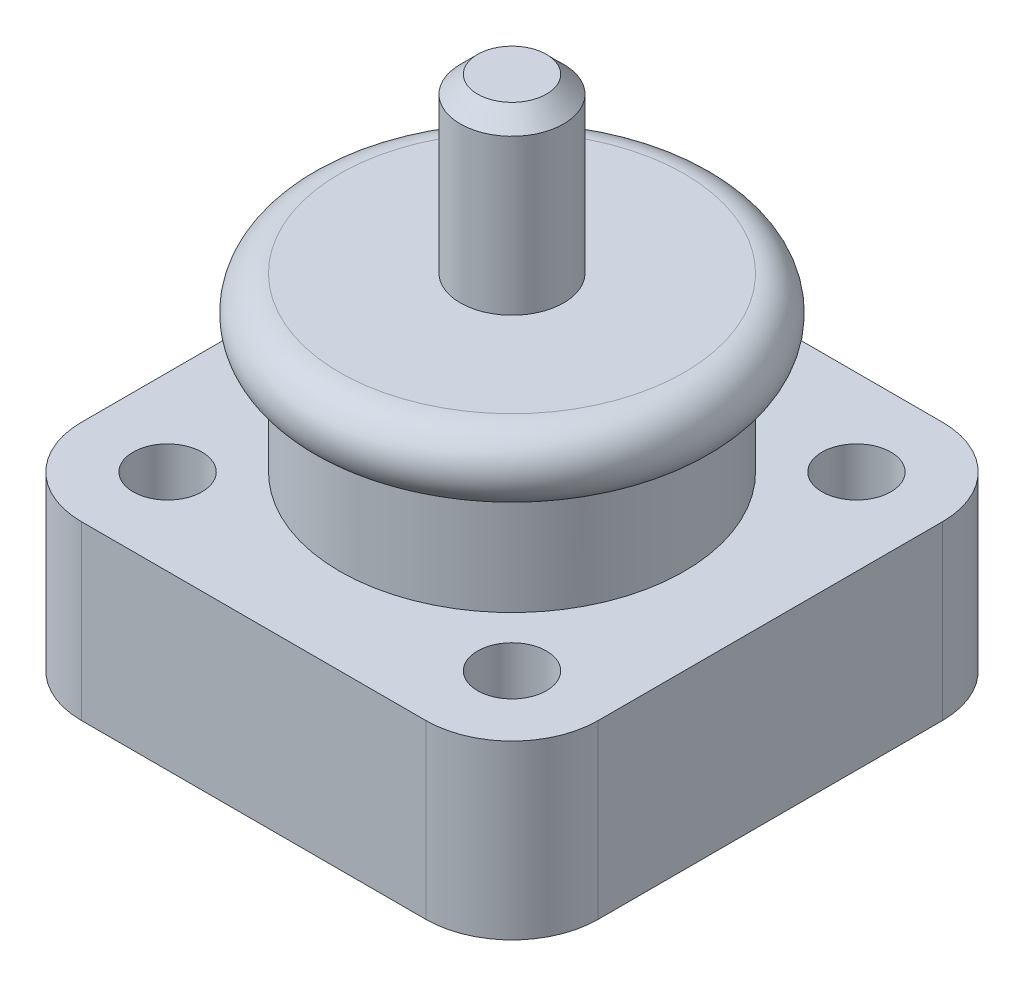
ISO-10303-21;
HEADER;
FILE_DESCRIPTION(('STEP AP214'),'2;1');
FILE_NAME('part.step','',(''),(''),'','','');
FILE_SCHEMA(('AUTOMOTIVE_DESIGN { 1 0 10303 214 1 1 1 1 }'));
ENDSEC;
DATA;
#1=APPLICATION_CONTEXT('core data for automotive mechanical design processes');
#2=APPLICATION_PROTOCOL_DEFINITION('international standard','automotive_design',2000,#1);
#3=PRODUCT_CONTEXT('',#1,'mechanical');
#4=PRODUCT('Part','Part','',(#3));
#5=PRODUCT_RELATED_PRODUCT_CATEGORY('part','',(#4));
#6=PRODUCT_DEFINITION_FORMATION('','',#4);
#7=PRODUCT_DEFINITION_CONTEXT('part definition',#1,'design');
#8=PRODUCT_DEFINITION('design','',#6,#7);
#9=PRODUCT_DEFINITION_SHAPE('','',#8);
#10=(LENGTH_UNIT() NAMED_UNIT(*) SI_UNIT(.MILLI.,.METRE.));
#11=(NAMED_UNIT(*) PLANE_ANGLE_UNIT() SI_UNIT($,.RADIAN.));
#12=(NAMED_UNIT(*) SI_UNIT($,.STERADIAN.) SOLID_ANGLE_UNIT());
#13=UNCERTAINTY_MEASURE_WITH_UNIT(LENGTH_MEASURE(1.E-05),#10,'distance_accuracy_value','');
#14=(GEOMETRIC_REPRESENTATION_CONTEXT(3) GLOBAL_UNCERTAINTY_ASSIGNED_CONTEXT((#13)) GLOBAL_UNIT_ASSIGNED_CONTEXT((#10,
#11,#12)) REPRESENTATION_CONTEXT('',''));
#15=CARTESIAN_POINT('',(0.,0.,0.));
#16=DIRECTION('',(0.,0.,1.));
#17=DIRECTION('',(1.,0.,0.));
#18=AXIS2_PLACEMENT_3D('',#15,#16,#17);
#19=CARTESIAN_POINT('',(0.,20.,0.));
#20=DIRECTION('',(0.,-1.,0.));
#21=DIRECTION('',(0.,0.,-1.));
#22=AXIS2_PLACEMENT_3D('',#19,#20,#21);
#23=CYLINDRICAL_SURFACE('',#22,10.);
#24=CARTESIAN_POINT('',(0.,10.,0.));
#25=DIRECTION('',(0.,1.,0.));
#26=DIRECTION('',(0.,0.,1.));
#27=AXIS2_PLACEMENT_3D('',#24,#25,#26);
#28=CIRCLE('',#27,10.);
#29=CARTESIAN_POINT('',(0.,10.,10.));
#30=VERTEX_POINT('',#29);
#31=EDGE_CURVE('E177',#30,#30,#28,.T.);
#32=ORIENTED_EDGE('',*,*,#31,.T.);
#33=EDGE_LOOP('',(#32));
#34=FACE_BOUND('',#33,.T.);
#35=CARTESIAN_POINT('',(0.,16.,0.));
#36=DIRECTION('',(0.,1.,0.));
#37=DIRECTION('',(0.,0.,1.));
#38=AXIS2_PLACEMENT_3D('',#35,#36,#37);
#39=CIRCLE('',#38,10.);
#40=CARTESIAN_POINT('',(0.,16.,10.));
#41=VERTEX_POINT('',#40);
#42=EDGE_CURVE('E165',#41,#41,#39,.T.);
#43=ORIENTED_EDGE('',*,*,#42,.F.);
#44=EDGE_LOOP('',(#43));
#45=FACE_BOUND('',#44,.T.);
#46=ADVANCED_FACE('F37',(#34,#45),#23,.T.);
#47=CARTESIAN_POINT('',(10.,10.,10.));
#48=DIRECTION('',(0.,1.,0.));
#49=DIRECTION('',(0.,0.,1.));
#50=AXIS2_PLACEMENT_3D('',#47,#48,#49);
#51=PLANE('',#50);
#52=ORIENTED_EDGE('',*,*,#31,.F.);
#53=EDGE_LOOP('',(#52));
#54=FACE_BOUND('',#53,.T.);
#55=CARTESIAN_POINT('',(-9.99999999999999,10.,10.));
#56=DIRECTION('',(0.,1.,0.));
#57=DIRECTION('',(0.,0.,1.));
#58=AXIS2_PLACEMENT_3D('',#55,#56,#57);
#59=CIRCLE('',#58,2.);
#60=CARTESIAN_POINT('',(-9.99999999999999,10.,12.));
#61=VERTEX_POINT('',#60);
#62=EDGE_CURVE('E187',#61,#61,#59,.T.);
#63=ORIENTED_EDGE('',*,*,#62,.F.);
#64=EDGE_LOOP('',(#63));
#65=FACE_BOUND('',#64,.T.);
#66=CARTESIAN_POINT('',(10.,10.,-10.));
#67=DIRECTION('',(0.,1.,0.));
#68=DIRECTION('',(0.,0.,1.));
#69=AXIS2_PLACEMENT_3D('',#66,#67,#68);
#70=CIRCLE('',#69,2.);
#71=CARTESIAN_POINT('',(10.,10.,-8.));
#72=VERTEX_POINT('',#71);
#73=EDGE_CURVE('E140',#72,#72,#70,.T.);
#74=ORIENTED_EDGE('',*,*,#73,.F.);
#75=EDGE_LOOP('',(#74));
#76=FACE_BOUND('',#75,.T.);
#77=CARTESIAN_POINT('',(10.,10.,10.));
#78=DIRECTION('',(0.,1.,0.));
#79=DIRECTION('',(0.,0.,1.));
#80=AXIS2_PLACEMENT_3D('',#77,#78,#79);
#81=CIRCLE('',#80,5.);
#82=CARTESIAN_POINT('',(9.99999999999997,10.,15.));
#83=VERTEX_POINT('',#82);
#84=CARTESIAN_POINT('',(15.,10.,9.99999999999997));
#85=VERTEX_POINT('',#84);
#86=EDGE_CURVE('E151',#83,#85,#81,.T.);
#87=ORIENTED_EDGE('',*,*,#86,.T.);
#88=DIRECTION('',(0.,0.,-1.));
#89=VECTOR('',#88,1.);
#90=CARTESIAN_POINT('',(15.,10.,9.99999999999997));
#91=LINE('',#90,#89);
#92=CARTESIAN_POINT('',(15.,10.,-9.99999999999996));
#93=VERTEX_POINT('',#92);
#94=EDGE_CURVE('E98',#85,#93,#91,.T.);
#95=ORIENTED_EDGE('',*,*,#94,.T.);
#96=CARTESIAN_POINT('',(10.,10.,-10.));
#97=DIRECTION('',(0.,1.,0.));
#98=DIRECTION('',(0.,0.,1.));
#99=AXIS2_PLACEMENT_3D('',#96,#97,#98);
#100=CIRCLE('',#99,5.);
#101=CARTESIAN_POINT('',(9.99999999999997,10.,-15.));
#102=VERTEX_POINT('',#101);
#103=EDGE_CURVE('E205',#93,#102,#100,.T.);
#104=ORIENTED_EDGE('',*,*,#103,.T.);
#105=DIRECTION('',(-1.,0.,0.));
#106=VECTOR('',#105,1.);
#107=CARTESIAN_POINT('',(-9.99999999999996,10.,-15.));
#108=LINE('',#107,#106);
#109=CARTESIAN_POINT('',(-9.99999999999999,10.,-15.));
#110=VERTEX_POINT('',#109);
#111=EDGE_CURVE('E207',#102,#110,#108,.T.);
#112=ORIENTED_EDGE('',*,*,#111,.T.);
#113=CARTESIAN_POINT('',(-9.99999999999999,10.,-10.));
#114=DIRECTION('',(0.,1.,0.));
#115=DIRECTION('',(0.,0.,-1.));
#116=AXIS2_PLACEMENT_3D('',#113,#114,#115);
#117=CIRCLE('',#116,5.);
#118=CARTESIAN_POINT('',(-15.,10.,-9.99999999999996));
#119=VERTEX_POINT('',#118);
#120=EDGE_CURVE('E118',#110,#119,#117,.T.);
#121=ORIENTED_EDGE('',*,*,#120,.T.);
#122=DIRECTION('',(0.,0.,1.));
#123=VECTOR('',#122,1.);
#124=CARTESIAN_POINT('',(-15.,10.,9.99999999999997));
#125=LINE('',#124,#123);
#126=CARTESIAN_POINT('',(-15.,10.,9.99999999999997));
#127=VERTEX_POINT('',#126);
#128=EDGE_CURVE('E111',#119,#127,#125,.T.);
#129=ORIENTED_EDGE('',*,*,#128,.T.);
#130=CARTESIAN_POINT('',(-9.99999999999999,10.,10.));
#131=DIRECTION('',(0.,1.,0.));
#132=DIRECTION('',(0.,0.,-1.));
#133=AXIS2_PLACEMENT_3D('',#130,#131,#132);
#134=CIRCLE('',#133,5.);
#135=CARTESIAN_POINT('',(-9.99999999999996,10.,15.));
#136=VERTEX_POINT('',#135);
#137=EDGE_CURVE('E116',#127,#136,#134,.T.);
#138=ORIENTED_EDGE('',*,*,#137,.T.);
#139=DIRECTION('',(1.,0.,0.));
#140=VECTOR('',#139,1.);
#141=CARTESIAN_POINT('',(-9.99999999999996,10.,15.));
#142=LINE('',#141,#140);
#143=EDGE_CURVE('E54',#136,#83,#142,.T.);
#144=ORIENTED_EDGE('',*,*,#143,.T.);
#145=EDGE_LOOP('',(#87,#95,#104,#112,#121,#129,#138,#144));
#146=FACE_BOUND('',#145,.T.);
#147=CARTESIAN_POINT('',(-9.99999999999999,10.,-10.));
#148=DIRECTION('',(0.,1.,0.));
#149=DIRECTION('',(0.,0.,1.));
#150=AXIS2_PLACEMENT_3D('',#147,#148,#149);
#151=CIRCLE('',#150,2.);
#152=CARTESIAN_POINT('',(-9.99999999999999,10.,-8.));
#153=VERTEX_POINT('',#152);
#154=EDGE_CURVE('E193',#153,#153,#151,.T.);
#155=ORIENTED_EDGE('',*,*,#154,.F.);
#156=EDGE_LOOP('',(#155));
#157=FACE_BOUND('',#156,.T.);
#158=CARTESIAN_POINT('',(10.,10.,10.));
#159=DIRECTION('',(0.,1.,0.));
#160=DIRECTION('',(0.,0.,1.));
#161=AXIS2_PLACEMENT_3D('',#158,#159,#160);
#162=CIRCLE('',#161,2.);
#163=CARTESIAN_POINT('',(10.,10.,12.));
#164=VERTEX_POINT('',#163);
#165=EDGE_CURVE('E181',#164,#164,#162,.T.);
#166=ORIENTED_EDGE('',*,*,#165,.F.);
#167=EDGE_LOOP('',(#166));
#168=FACE_BOUND('',#167,.T.);
#169=ADVANCED_FACE('F113',(#54,#65,#76,#146,#157,#168),#51,.T.);
#170=CARTESIAN_POINT('',(10.,0.,10.));
#171=DIRECTION('',(0.,1.,0.));
#172=DIRECTION('',(0.,0.,1.));
#173=AXIS2_PLACEMENT_3D('',#170,#171,#172);
#174=PLANE('',#173);
#175=CARTESIAN_POINT('',(0.,0.,0.));
#176=DIRECTION('',(0.,-1.,0.));
#177=DIRECTION('',(0.,0.,-1.));
#178=AXIS2_PLACEMENT_3D('',#175,#176,#177);
#179=CIRCLE('',#178,8.);
#180=CARTESIAN_POINT('',(0.,0.,-8.));
#181=VERTEX_POINT('',#180);
#182=EDGE_CURVE('E272',#181,#181,#179,.T.);
#183=ORIENTED_EDGE('',*,*,#182,.F.);
#184=EDGE_LOOP('',(#183));
#185=FACE_BOUND('',#184,.T.);
#186=CARTESIAN_POINT('',(10.,0.,10.));
#187=DIRECTION('',(0.,1.,0.));
#188=DIRECTION('',(0.,0.,1.));
#189=AXIS2_PLACEMENT_3D('',#186,#187,#188);
#190=CIRCLE('',#189,5.);
#191=CARTESIAN_POINT('',(9.99999999999997,0.,15.));
#192=VERTEX_POINT('',#191);
#193=CARTESIAN_POINT('',(15.,0.,9.99999999999997));
#194=VERTEX_POINT('',#193);
#195=EDGE_CURVE('E136',#192,#194,#190,.T.);
#196=ORIENTED_EDGE('',*,*,#195,.F.);
#197=DIRECTION('',(1.,0.,0.));
#198=VECTOR('',#197,1.);
#199=CARTESIAN_POINT('',(-9.99999999999996,0.,15.));
#200=LINE('',#199,#198);
#201=CARTESIAN_POINT('',(-9.99999999999996,0.,15.));
#202=VERTEX_POINT('',#201);
#203=EDGE_CURVE('E89',#202,#192,#200,.T.);
#204=ORIENTED_EDGE('',*,*,#203,.F.);
#205=CARTESIAN_POINT('',(-9.99999999999999,0.,10.));
#206=DIRECTION('',(0.,1.,0.));
#207=DIRECTION('',(0.,0.,-1.));
#208=AXIS2_PLACEMENT_3D('',#205,#206,#207);
#209=CIRCLE('',#208,5.);
#210=CARTESIAN_POINT('',(-15.,0.,9.99999999999997));
#211=VERTEX_POINT('',#210);
#212=EDGE_CURVE('E83',#211,#202,#209,.T.);
#213=ORIENTED_EDGE('',*,*,#212,.F.);
#214=DIRECTION('',(0.,0.,1.));
#215=VECTOR('',#214,1.);
#216=CARTESIAN_POINT('',(-15.,0.,9.99999999999997));
#217=LINE('',#216,#215);
#218=CARTESIAN_POINT('',(-15.,0.,-9.99999999999996));
#219=VERTEX_POINT('',#218);
#220=EDGE_CURVE('E126',#219,#211,#217,.T.);
#221=ORIENTED_EDGE('',*,*,#220,.F.);
#222=CARTESIAN_POINT('',(-9.99999999999999,0.,-10.));
#223=DIRECTION('',(0.,1.,0.));
#224=DIRECTION('',(0.,0.,-1.));
#225=AXIS2_PLACEMENT_3D('',#222,#223,#224);
#226=CIRCLE('',#225,5.);
#227=CARTESIAN_POINT('',(-9.99999999999999,0.,-15.));
#228=VERTEX_POINT('',#227);
#229=EDGE_CURVE('E146',#228,#219,#226,.T.);
#230=ORIENTED_EDGE('',*,*,#229,.F.);
#231=DIRECTION('',(-1.,0.,0.));
#232=VECTOR('',#231,1.);
#233=CARTESIAN_POINT('',(-9.99999999999996,0.,-15.));
#234=LINE('',#233,#232);
#235=CARTESIAN_POINT('',(9.99999999999997,0.,-15.));
#236=VERTEX_POINT('',#235);
#237=EDGE_CURVE('E144',#236,#228,#234,.T.);
#238=ORIENTED_EDGE('',*,*,#237,.F.);
#239=CARTESIAN_POINT('',(10.,0.,-10.));
#240=DIRECTION('',(0.,1.,0.));
#241=DIRECTION('',(0.,0.,1.));
#242=AXIS2_PLACEMENT_3D('',#239,#240,#241);
#243=CIRCLE('',#242,5.);
#244=CARTESIAN_POINT('',(15.,0.,-9.99999999999996));
#245=VERTEX_POINT('',#244);
#246=EDGE_CURVE('E142',#245,#236,#243,.T.);
#247=ORIENTED_EDGE('',*,*,#246,.F.);
#248=DIRECTION('',(0.,0.,-1.));
#249=VECTOR('',#248,1.);
#250=CARTESIAN_POINT('',(15.,0.,9.99999999999997));
#251=LINE('',#250,#249);
#252=EDGE_CURVE('E139',#194,#245,#251,.T.);
#253=ORIENTED_EDGE('',*,*,#252,.F.);
#254=EDGE_LOOP('',(#196,#204,#213,#221,#230,#238,#247,#253));
#255=FACE_BOUND('',#254,.T.);
#256=CARTESIAN_POINT('',(10.,0.,-10.));
#257=DIRECTION('',(0.,1.,0.));
#258=DIRECTION('',(0.,0.,1.));
#259=AXIS2_PLACEMENT_3D('',#256,#257,#258);
#260=CIRCLE('',#259,2.);
#261=CARTESIAN_POINT('',(10.,0.,-8.));
#262=VERTEX_POINT('',#261);
#263=EDGE_CURVE('E196',#262,#262,#260,.T.);
#264=ORIENTED_EDGE('',*,*,#263,.T.);
#265=EDGE_LOOP('',(#264));
#266=FACE_BOUND('',#265,.T.);
#267=CARTESIAN_POINT('',(-9.99999999999999,0.,-10.));
#268=DIRECTION('',(0.,1.,0.));
#269=DIRECTION('',(0.,0.,1.));
#270=AXIS2_PLACEMENT_3D('',#267,#268,#269);
#271=CIRCLE('',#270,2.);
#272=CARTESIAN_POINT('',(-9.99999999999999,0.,-8.));
#273=VERTEX_POINT('',#272);
#274=EDGE_CURVE('E190',#273,#273,#271,.T.);
#275=ORIENTED_EDGE('',*,*,#274,.T.);
#276=EDGE_LOOP('',(#275));
#277=FACE_BOUND('',#276,.T.);
#278=CARTESIAN_POINT('',(-9.99999999999999,0.,10.));
#279=DIRECTION('',(0.,1.,0.));
#280=DIRECTION('',(0.,0.,1.));
#281=AXIS2_PLACEMENT_3D('',#278,#279,#280);
#282=CIRCLE('',#281,2.);
#283=CARTESIAN_POINT('',(-9.99999999999999,0.,12.));
#284=VERTEX_POINT('',#283);
#285=EDGE_CURVE('E184',#284,#284,#282,.T.);
#286=ORIENTED_EDGE('',*,*,#285,.T.);
#287=EDGE_LOOP('',(#286));
#288=FACE_BOUND('',#287,.T.);
#289=CARTESIAN_POINT('',(10.,0.,10.));
#290=DIRECTION('',(0.,1.,0.));
#291=DIRECTION('',(0.,0.,1.));
#292=AXIS2_PLACEMENT_3D('',#289,#290,#291);
#293=CIRCLE('',#292,2.);
#294=CARTESIAN_POINT('',(10.,0.,12.));
#295=VERTEX_POINT('',#294);
#296=EDGE_CURVE('E180',#295,#295,#293,.T.);
#297=ORIENTED_EDGE('',*,*,#296,.T.);
#298=EDGE_LOOP('',(#297));
#299=FACE_BOUND('',#298,.T.);
#300=ADVANCED_FACE('F220',(#185,#255,#266,#277,#288,#299),#174,.F.);
#301=CARTESIAN_POINT('',(10.,10.,10.));
#302=DIRECTION('',(0.,-1.,0.));
#303=DIRECTION('',(0.,0.,-1.));
#304=AXIS2_PLACEMENT_3D('',#301,#302,#303);
#305=CYLINDRICAL_SURFACE('',#304,5.);
#306=ORIENTED_EDGE('',*,*,#195,.T.);
#307=DIRECTION('',(0.,-1.,0.));
#308=VECTOR('',#307,1.);
#309=CARTESIAN_POINT('',(15.,10.,9.99999999999997));
#310=LINE('',#309,#308);
#311=EDGE_CURVE('E164',#85,#194,#310,.T.);
#312=ORIENTED_EDGE('',*,*,#311,.F.);
#313=ORIENTED_EDGE('',*,*,#86,.F.);
#314=DIRECTION('',(0.,-1.,0.));
#315=VECTOR('',#314,1.);
#316=CARTESIAN_POINT('',(9.99999999999997,10.,15.));
#317=LINE('',#316,#315);
#318=EDGE_CURVE('E132',#83,#192,#317,.T.);
#319=ORIENTED_EDGE('',*,*,#318,.T.);
#320=EDGE_LOOP('',(#306,#312,#313,#319));
#321=FACE_BOUND('',#320,.T.);
#322=ADVANCED_FACE('F225',(#321),#305,.T.);
#323=CARTESIAN_POINT('',(15.,10.,9.99999999999997));
#324=DIRECTION('',(-1.,0.,0.));
#325=DIRECTION('',(0.,0.,1.));
#326=AXIS2_PLACEMENT_3D('',#323,#324,#325);
#327=PLANE('',#326);
#328=ORIENTED_EDGE('',*,*,#252,.T.);
#329=DIRECTION('',(0.,-1.,0.));
#330=VECTOR('',#329,1.);
#331=CARTESIAN_POINT('',(15.,10.,-9.99999999999996));
#332=LINE('',#331,#330);
#333=EDGE_CURVE('E161',#93,#245,#332,.T.);
#334=ORIENTED_EDGE('',*,*,#333,.F.);
#335=ORIENTED_EDGE('',*,*,#94,.F.);
#336=ORIENTED_EDGE('',*,*,#311,.T.);
#337=EDGE_LOOP('',(#328,#334,#335,#336));
#338=FACE_BOUND('',#337,.T.);
#339=ADVANCED_FACE('F269',(#338),#327,.F.);
#340=CARTESIAN_POINT('',(10.,10.,-10.));
#341=DIRECTION('',(0.,-1.,0.));
#342=DIRECTION('',(0.,0.,-1.));
#343=AXIS2_PLACEMENT_3D('',#340,#341,#342);
#344=CYLINDRICAL_SURFACE('',#343,5.);
#345=ORIENTED_EDGE('',*,*,#246,.T.);
#346=DIRECTION('',(0.,-1.,0.));
#347=VECTOR('',#346,1.);
#348=CARTESIAN_POINT('',(9.99999999999997,10.,-15.));
#349=LINE('',#348,#347);
#350=EDGE_CURVE('E158',#102,#236,#349,.T.);
#351=ORIENTED_EDGE('',*,*,#350,.F.);
#352=ORIENTED_EDGE('',*,*,#103,.F.);
#353=ORIENTED_EDGE('',*,*,#333,.T.);
#354=EDGE_LOOP('',(#345,#351,#352,#353));
#355=FACE_BOUND('',#354,.T.);
#356=ADVANCED_FACE('F417',(#355),#344,.T.);
#357=CARTESIAN_POINT('',(-9.99999999999996,10.,-15.));
#358=DIRECTION('',(0.,0.,1.));
#359=DIRECTION('',(1.,0.,0.));
#360=AXIS2_PLACEMENT_3D('',#357,#358,#359);
#361=PLANE('',#360);
#362=ORIENTED_EDGE('',*,*,#237,.T.);
#363=DIRECTION('',(0.,-1.,0.));
#364=VECTOR('',#363,1.);
#365=CARTESIAN_POINT('',(-9.99999999999999,10.,-15.));
#366=LINE('',#365,#364);
#367=EDGE_CURVE('E155',#110,#228,#366,.T.);
#368=ORIENTED_EDGE('',*,*,#367,.F.);
#369=ORIENTED_EDGE('',*,*,#111,.F.);
#370=ORIENTED_EDGE('',*,*,#350,.T.);
#371=EDGE_LOOP('',(#362,#368,#369,#370));
#372=FACE_BOUND('',#371,.T.);
#373=ADVANCED_FACE('F213',(#372),#361,.F.);
#374=CARTESIAN_POINT('',(-9.99999999999999,10.,-10.));
#375=DIRECTION('',(0.,-1.,0.));
#376=DIRECTION('',(0.,0.,-1.));
#377=AXIS2_PLACEMENT_3D('',#374,#375,#376);
#378=CYLINDRICAL_SURFACE('',#377,5.);
#379=ORIENTED_EDGE('',*,*,#229,.T.);
#380=DIRECTION('',(0.,-1.,0.));
#381=VECTOR('',#380,1.);
#382=CARTESIAN_POINT('',(-15.,10.,-9.99999999999996));
#383=LINE('',#382,#381);
#384=EDGE_CURVE('E127',#119,#219,#383,.T.);
#385=ORIENTED_EDGE('',*,*,#384,.F.);
#386=ORIENTED_EDGE('',*,*,#120,.F.);
#387=ORIENTED_EDGE('',*,*,#367,.T.);
#388=EDGE_LOOP('',(#379,#385,#386,#387));
#389=FACE_BOUND('',#388,.T.);
#390=ADVANCED_FACE('F217',(#389),#378,.T.);
#391=CARTESIAN_POINT('',(-15.,10.,9.99999999999997));
#392=DIRECTION('',(1.,0.,0.));
#393=DIRECTION('',(0.,0.,-1.));
#394=AXIS2_PLACEMENT_3D('',#391,#392,#393);
#395=PLANE('',#394);
#396=ORIENTED_EDGE('',*,*,#220,.T.);
#397=DIRECTION('',(0.,-1.,0.));
#398=VECTOR('',#397,1.);
#399=CARTESIAN_POINT('',(-15.,10.,9.99999999999997));
#400=LINE('',#399,#398);
#401=EDGE_CURVE('E123',#127,#211,#400,.T.);
#402=ORIENTED_EDGE('',*,*,#401,.F.);
#403=ORIENTED_EDGE('',*,*,#128,.F.);
#404=ORIENTED_EDGE('',*,*,#384,.T.);
#405=EDGE_LOOP('',(#396,#402,#403,#404));
#406=FACE_BOUND('',#405,.T.);
#407=ADVANCED_FACE('F124',(#406),#395,.F.);
#408=CARTESIAN_POINT('',(-9.99999999999999,10.,10.));
#409=DIRECTION('',(0.,-1.,0.));
#410=DIRECTION('',(0.,0.,-1.));
#411=AXIS2_PLACEMENT_3D('',#408,#409,#410);
#412=CYLINDRICAL_SURFACE('',#411,5.);
#413=ORIENTED_EDGE('',*,*,#212,.T.);
#414=DIRECTION('',(0.,-1.,0.));
#415=VECTOR('',#414,1.);
#416=CARTESIAN_POINT('',(-9.99999999999996,10.,15.));
#417=LINE('',#416,#415);
#418=EDGE_CURVE('E128',#136,#202,#417,.T.);
#419=ORIENTED_EDGE('',*,*,#418,.F.);
#420=ORIENTED_EDGE('',*,*,#137,.F.);
#421=ORIENTED_EDGE('',*,*,#401,.T.);
#422=EDGE_LOOP('',(#413,#419,#420,#421));
#423=FACE_BOUND('',#422,.T.);
#424=ADVANCED_FACE('F130',(#423),#412,.T.);
#425=CARTESIAN_POINT('',(-9.99999999999996,10.,15.));
#426=DIRECTION('',(0.,0.,-1.));
#427=DIRECTION('',(-1.,0.,0.));
#428=AXIS2_PLACEMENT_3D('',#425,#426,#427);
#429=PLANE('',#428);
#430=ORIENTED_EDGE('',*,*,#203,.T.);
#431=ORIENTED_EDGE('',*,*,#318,.F.);
#432=ORIENTED_EDGE('',*,*,#143,.F.);
#433=ORIENTED_EDGE('',*,*,#418,.T.);
#434=EDGE_LOOP('',(#430,#431,#432,#433));
#435=FACE_BOUND('',#434,.T.);
#436=ADVANCED_FACE('F227',(#435),#429,.F.);
#437=CARTESIAN_POINT('',(10.,10.,-10.));
#438=DIRECTION('',(0.,-1.,0.));
#439=DIRECTION('',(0.,0.,-1.));
#440=AXIS2_PLACEMENT_3D('',#437,#438,#439);
#441=CYLINDRICAL_SURFACE('',#440,2.);
#442=ORIENTED_EDGE('',*,*,#73,.T.);
#443=EDGE_LOOP('',(#442));
#444=FACE_BOUND('',#443,.T.);
#445=ORIENTED_EDGE('',*,*,#263,.F.);
#446=EDGE_LOOP('',(#445));
#447=FACE_BOUND('',#446,.T.);
#448=ADVANCED_FACE('F229',(#444,#447),#441,.F.);
#449=CARTESIAN_POINT('',(-9.99999999999999,10.,-10.));
#450=DIRECTION('',(0.,-1.,0.));
#451=DIRECTION('',(0.,0.,-1.));
#452=AXIS2_PLACEMENT_3D('',#449,#450,#451);
#453=CYLINDRICAL_SURFACE('',#452,2.);
#454=ORIENTED_EDGE('',*,*,#154,.T.);
#455=EDGE_LOOP('',(#454));
#456=FACE_BOUND('',#455,.T.);
#457=ORIENTED_EDGE('',*,*,#274,.F.);
#458=EDGE_LOOP('',(#457));
#459=FACE_BOUND('',#458,.T.);
#460=ADVANCED_FACE('F235',(#456,#459),#453,.F.);
#461=CARTESIAN_POINT('',(-9.99999999999999,10.,10.));
#462=DIRECTION('',(0.,-1.,0.));
#463=DIRECTION('',(0.,0.,-1.));
#464=AXIS2_PLACEMENT_3D('',#461,#462,#463);
#465=CYLINDRICAL_SURFACE('',#464,2.);
#466=ORIENTED_EDGE('',*,*,#62,.T.);
#467=EDGE_LOOP('',(#466));
#468=FACE_BOUND('',#467,.T.);
#469=ORIENTED_EDGE('',*,*,#285,.F.);
#470=EDGE_LOOP('',(#469));
#471=FACE_BOUND('',#470,.T.);
#472=ADVANCED_FACE('F257',(#468,#471),#465,.F.);
#473=CARTESIAN_POINT('',(10.,10.,10.));
#474=DIRECTION('',(0.,-1.,0.));
#475=DIRECTION('',(0.,0.,-1.));
#476=AXIS2_PLACEMENT_3D('',#473,#474,#475);
#477=CYLINDRICAL_SURFACE('',#476,2.);
#478=ORIENTED_EDGE('',*,*,#165,.T.);
#479=EDGE_LOOP('',(#478));
#480=FACE_BOUND('',#479,.T.);
#481=ORIENTED_EDGE('',*,*,#296,.F.);
#482=EDGE_LOOP('',(#481));
#483=FACE_BOUND('',#482,.T.);
#484=ADVANCED_FACE('F253',(#480,#483),#477,.F.);
#485=CARTESIAN_POINT('',(0.,18.,0.));
#486=DIRECTION('',(0.,-1.,0.));
#487=DIRECTION('',(0.,0.,-1.));
#488=AXIS2_PLACEMENT_3D('',#485,#486,#487);
#489=TOROIDAL_SURFACE('',#488,10.,2.);
#490=CARTESIAN_POINT('',(0.,20.,0.));
#491=DIRECTION('',(0.,-1.,0.));
#492=DIRECTION('',(0.,0.,-1.));
#493=AXIS2_PLACEMENT_3D('',#490,#491,#492);
#494=CIRCLE('',#493,10.);
#495=CARTESIAN_POINT('',(0.,20.,-10.));
#496=VERTEX_POINT('',#495);
#497=EDGE_CURVE('E175',#496,#496,#494,.F.);
#498=ORIENTED_EDGE('',*,*,#497,.F.);
#499=EDGE_LOOP('',(#498));
#500=FACE_BOUND('',#499,.T.);
#501=ORIENTED_EDGE('',*,*,#42,.T.);
#502=EDGE_LOOP('',(#501));
#503=FACE_BOUND('',#502,.T.);
#504=ADVANCED_FACE('F256',(#500,#503),#489,.T.);
#505=CARTESIAN_POINT('',(0.,20.,0.));
#506=DIRECTION('',(0.,1.,0.));
#507=DIRECTION('',(0.,0.,1.));
#508=AXIS2_PLACEMENT_3D('',#505,#506,#507);
#509=PLANE('',#508);
#510=CARTESIAN_POINT('',(0.,20.,0.));
#511=DIRECTION('',(0.,1.,0.));
#512=DIRECTION('',(0.,0.,1.));
#513=AXIS2_PLACEMENT_3D('',#510,#511,#512);
#514=CIRCLE('',#513,3.);
#515=CARTESIAN_POINT('',(0.,20.,3.));
#516=VERTEX_POINT('',#515);
#517=EDGE_CURVE('E277',#516,#516,#514,.T.);
#518=ORIENTED_EDGE('',*,*,#517,.F.);
#519=EDGE_LOOP('',(#518));
#520=FACE_BOUND('',#519,.T.);
#521=ORIENTED_EDGE('',*,*,#497,.T.);
#522=EDGE_LOOP('',(#521));
#523=FACE_BOUND('',#522,.T.);
#524=ADVANCED_FACE('F251',(#520,#523),#509,.T.);
#525=CARTESIAN_POINT('',(0.,30.,0.));
#526=DIRECTION('',(0.,-1.,0.));
#527=DIRECTION('',(0.,0.,-1.));
#528=AXIS2_PLACEMENT_3D('',#525,#526,#527);
#529=CYLINDRICAL_SURFACE('',#528,3.);
#530=CARTESIAN_POINT('',(0.,29.,0.));
#531=DIRECTION('',(0.,1.,0.));
#532=DIRECTION('',(0.,0.,1.));
#533=AXIS2_PLACEMENT_3D('',#530,#531,#532);
#534=CIRCLE('',#533,3.);
#535=CARTESIAN_POINT('',(0.,29.,3.));
#536=VERTEX_POINT('',#535);
#537=EDGE_CURVE('E11',#536,#536,#534,.F.);
#538=ORIENTED_EDGE('',*,*,#537,.T.);
#539=EDGE_LOOP('',(#538));
#540=FACE_BOUND('',#539,.T.);
#541=ORIENTED_EDGE('',*,*,#517,.T.);
#542=EDGE_LOOP('',(#541));
#543=FACE_BOUND('',#542,.T.);
#544=ADVANCED_FACE('F290',(#540,#543),#529,.T.);
#545=CARTESIAN_POINT('',(0.,30.,0.));
#546=DIRECTION('',(0.,1.,0.));
#547=DIRECTION('',(0.,0.,1.));
#548=AXIS2_PLACEMENT_3D('',#545,#546,#547);
#549=PLANE('',#548);
#550=CARTESIAN_POINT('',(0.,30.,0.));
#551=DIRECTION('',(0.,1.,0.));
#552=DIRECTION('',(0.,0.,1.));
#553=AXIS2_PLACEMENT_3D('',#550,#551,#552);
#554=CIRCLE('',#553,1.99999999999999);
#555=CARTESIAN_POINT('',(0.,30.,1.99999999999999));
#556=VERTEX_POINT('',#555);
#557=EDGE_CURVE('E46',#556,#556,#554,.T.);
#558=ORIENTED_EDGE('',*,*,#557,.T.);
#559=EDGE_LOOP('',(#558));
#560=FACE_BOUND('',#559,.T.);
#561=ADVANCED_FACE('F295',(#560),#549,.T.);
#562=CARTESIAN_POINT('',(0.,30.,0.));
#563=DIRECTION('',(0.,-1.,0.));
#564=DIRECTION('',(0.,0.,-1.));
#565=AXIS2_PLACEMENT_3D('',#562,#563,#564);
#566=CONICAL_SURFACE('',#565,1.99999999999999,0.785398163397446);
#567=ORIENTED_EDGE('',*,*,#537,.F.);
#568=EDGE_LOOP('',(#567));
#569=FACE_BOUND('',#568,.T.);
#570=ORIENTED_EDGE('',*,*,#557,.F.);
#571=EDGE_LOOP('',(#570));
#572=FACE_BOUND('',#571,.T.);
#573=ADVANCED_FACE('F39',(#569,#572),#566,.T.);
#574=CARTESIAN_POINT('',(0.,2.,0.));
#575=DIRECTION('',(0.,-1.,0.));
#576=DIRECTION('',(0.,0.,-1.));
#577=AXIS2_PLACEMENT_3D('',#574,#575,#576);
#578=CYLINDRICAL_SURFACE('',#577,8.);
#579=CARTESIAN_POINT('',(0.,2.,0.));
#580=DIRECTION('',(0.,-1.,0.));
#581=DIRECTION('',(0.,0.,-1.));
#582=AXIS2_PLACEMENT_3D('',#579,#580,#581);
#583=CIRCLE('',#582,8.);
#584=CARTESIAN_POINT('',(0.,2.,-8.));
#585=VERTEX_POINT('',#584);
#586=EDGE_CURVE('E274',#585,#585,#583,.T.);
#587=ORIENTED_EDGE('',*,*,#586,.F.);
#588=EDGE_LOOP('',(#587));
#589=FACE_BOUND('',#588,.T.);
#590=ORIENTED_EDGE('',*,*,#182,.T.);
#591=EDGE_LOOP('',(#590));
#592=FACE_BOUND('',#591,.T.);
#593=ADVANCED_FACE('F299',(#589,#592),#578,.F.);
#594=CARTESIAN_POINT('',(0.,2.,0.));
#595=DIRECTION('',(0.,-1.,0.));
#596=DIRECTION('',(0.,0.,-1.));
#597=AXIS2_PLACEMENT_3D('',#594,#595,#596);
#598=PLANE('',#597);
#599=ORIENTED_EDGE('',*,*,#586,.T.);
#600=EDGE_LOOP('',(#599));
#601=FACE_BOUND('',#600,.T.);
#602=ADVANCED_FACE('F302',(#601),#598,.T.);
#603=CLOSED_SHELL('',(#46,#169,#300,#322,#339,#356,#373,#390,#407,#424,#436,#448,#460,#472,#484,
#504,#524,#544,#561,#573,#593,#602));
#604=MANIFOLD_SOLID_BREP('B2',#603);
#605=ADVANCED_BREP_SHAPE_REPRESENTATION('',(#18,#604),#14);
#606=SHAPE_DEFINITION_REPRESENTATION(#9,#605);
ENDSEC;
END-ISO-10303-21;
